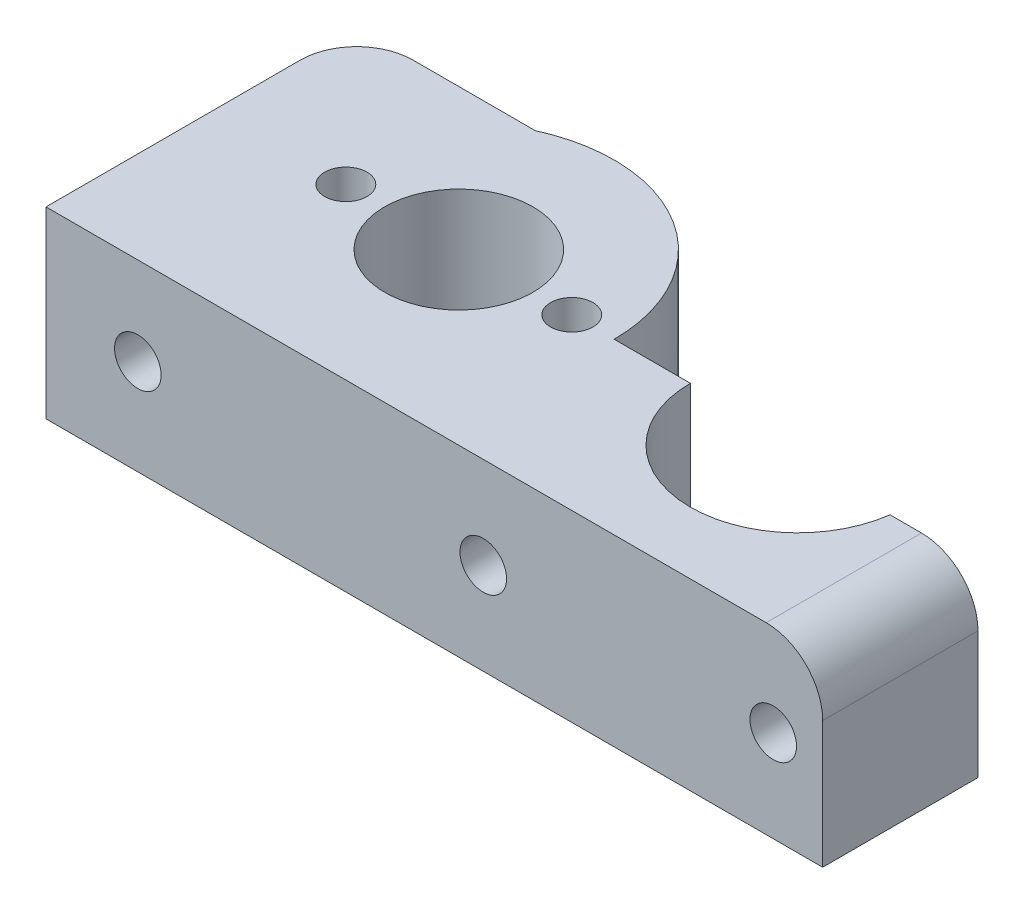
ISO-10303-21;
HEADER;
FILE_DESCRIPTION(('STEP AP214'),'2;1');
FILE_NAME('part.step','',(''),(''),'','','');
FILE_SCHEMA(('AUTOMOTIVE_DESIGN { 1 0 10303 214 1 1 1 1 }'));
ENDSEC;
DATA;
#1=APPLICATION_CONTEXT('core data for automotive mechanical design processes');
#2=APPLICATION_PROTOCOL_DEFINITION('international standard','automotive_design',2000,#1);
#3=PRODUCT_CONTEXT('',#1,'mechanical');
#4=PRODUCT('Part','Part','',(#3));
#5=PRODUCT_RELATED_PRODUCT_CATEGORY('part','',(#4));
#6=PRODUCT_DEFINITION_FORMATION('','',#4);
#7=PRODUCT_DEFINITION_CONTEXT('part definition',#1,'design');
#8=PRODUCT_DEFINITION('design','',#6,#7);
#9=PRODUCT_DEFINITION_SHAPE('','',#8);
#10=(LENGTH_UNIT() NAMED_UNIT(*) SI_UNIT(.MILLI.,.METRE.));
#11=(NAMED_UNIT(*) PLANE_ANGLE_UNIT() SI_UNIT($,.RADIAN.));
#12=(NAMED_UNIT(*) SI_UNIT($,.STERADIAN.) SOLID_ANGLE_UNIT());
#13=UNCERTAINTY_MEASURE_WITH_UNIT(LENGTH_MEASURE(1.E-05),#10,'distance_accuracy_value','');
#14=(GEOMETRIC_REPRESENTATION_CONTEXT(3) GLOBAL_UNCERTAINTY_ASSIGNED_CONTEXT((#13)) GLOBAL_UNIT_ASSIGNED_CONTEXT((#10,
#11,#12)) REPRESENTATION_CONTEXT('',''));
#15=CARTESIAN_POINT('',(0.,0.,0.));
#16=DIRECTION('',(0.,0.,1.));
#17=DIRECTION('',(1.,0.,0.));
#18=AXIS2_PLACEMENT_3D('',#15,#16,#17);
#19=CARTESIAN_POINT('',(12.,13.,0.));
#20=DIRECTION('',(0.,-1.,0.));
#21=DIRECTION('',(0.,0.,-1.));
#22=AXIS2_PLACEMENT_3D('',#19,#20,#21);
#23=CYLINDRICAL_SURFACE('',#22,7.6);
#24=CARTESIAN_POINT('',(12.,0.,0.));
#25=DIRECTION('',(0.,1.,0.));
#26=DIRECTION('',(0.,0.,1.));
#27=AXIS2_PLACEMENT_3D('',#24,#25,#26);
#28=CIRCLE('',#27,7.6);
#29=CARTESIAN_POINT('',(4.4,0.,0.));
#30=VERTEX_POINT('',#29);
#31=CARTESIAN_POINT('',(19.5339232807349,0.,0.999999999999997));
#32=VERTEX_POINT('',#31);
#33=EDGE_CURVE('E129',#30,#32,#28,.T.);
#34=ORIENTED_EDGE('',*,*,#33,.F.);
#35=DIRECTION('',(0.,-1.,0.));
#36=VECTOR('',#35,1.);
#37=CARTESIAN_POINT('',(4.4,13.,0.));
#38=LINE('',#37,#36);
#39=CARTESIAN_POINT('',(4.4,13.,0.));
#40=VERTEX_POINT('',#39);
#41=EDGE_CURVE('E123',#40,#30,#38,.T.);
#42=ORIENTED_EDGE('',*,*,#41,.F.);
#43=CARTESIAN_POINT('',(12.,13.,0.));
#44=DIRECTION('',(0.,1.,0.));
#45=DIRECTION('',(0.,0.,1.));
#46=AXIS2_PLACEMENT_3D('',#43,#44,#45);
#47=CIRCLE('',#46,7.6);
#48=CARTESIAN_POINT('',(19.5339232807349,13.,0.999999999999997));
#49=VERTEX_POINT('',#48);
#50=EDGE_CURVE('E126',#40,#49,#47,.T.);
#51=ORIENTED_EDGE('',*,*,#50,.T.);
#52=DIRECTION('',(0.,-1.,0.));
#53=VECTOR('',#52,1.);
#54=CARTESIAN_POINT('',(19.5339232807349,13.,0.999999999999997));
#55=LINE('',#54,#53);
#56=EDGE_CURVE('E176',#49,#32,#55,.T.);
#57=ORIENTED_EDGE('',*,*,#56,.T.);
#58=EDGE_LOOP('',(#34,#42,#51,#57));
#59=FACE_BOUND('',#58,.T.);
#60=ADVANCED_FACE('F41',(#59),#23,.F.);
#61=CARTESIAN_POINT('',(0.,13.,0.));
#62=DIRECTION('',(0.,0.,1.));
#63=DIRECTION('',(1.,0.,0.));
#64=AXIS2_PLACEMENT_3D('',#61,#62,#63);
#65=PLANE('',#64);
#66=CARTESIAN_POINT('',(1.73303835963196,6.50000000000074,0.));
#67=DIRECTION('',(0.,0.,1.));
#68=DIRECTION('',(1.,0.,0.));
#69=AXIS2_PLACEMENT_3D('',#66,#67,#68);
#70=CIRCLE('',#69,1.65000000000012);
#71=CARTESIAN_POINT('',(3.38303835963208,6.50000000000074,0.));
#72=VERTEX_POINT('',#71);
#73=EDGE_CURVE('E154',#72,#72,#70,.T.);
#74=ORIENTED_EDGE('',*,*,#73,.T.);
#75=EDGE_LOOP('',(#74));
#76=FACE_BOUND('',#75,.T.);
#77=DIRECTION('',(-1.,0.,0.));
#78=VECTOR('',#77,1.);
#79=CARTESIAN_POINT('',(0.,0.,0.));
#80=LINE('',#79,#78);
#81=CARTESIAN_POINT('',(-1.00000000000001,0.,0.));
#82=VERTEX_POINT('',#81);
#83=EDGE_CURVE('E178',#30,#82,#80,.T.);
#84=ORIENTED_EDGE('',*,*,#83,.T.);
#85=DIRECTION('',(0.,-1.,0.));
#86=VECTOR('',#85,1.);
#87=CARTESIAN_POINT('',(-1.00000000000001,13.,0.));
#88=LINE('',#87,#86);
#89=CARTESIAN_POINT('',(-1.00000000000001,13.,0.));
#90=VERTEX_POINT('',#89);
#91=EDGE_CURVE('E133',#90,#82,#88,.T.);
#92=ORIENTED_EDGE('',*,*,#91,.F.);
#93=DIRECTION('',(-1.,0.,0.));
#94=VECTOR('',#93,1.);
#95=CARTESIAN_POINT('',(0.,13.,0.));
#96=LINE('',#95,#94);
#97=EDGE_CURVE('E136',#40,#90,#96,.T.);
#98=ORIENTED_EDGE('',*,*,#97,.F.);
#99=ORIENTED_EDGE('',*,*,#41,.T.);
#100=EDGE_LOOP('',(#84,#92,#98,#99));
#101=FACE_BOUND('',#100,.T.);
#102=ADVANCED_FACE('F137',(#76,#101),#65,.F.);
#103=CARTESIAN_POINT('',(-12.,13.,0.));
#104=DIRECTION('',(0.,-1.,0.));
#105=DIRECTION('',(0.,0.,-1.));
#106=AXIS2_PLACEMENT_3D('',#103,#104,#105);
#107=CYLINDRICAL_SURFACE('',#106,11.);
#108=CARTESIAN_POINT('',(-12.,0.,0.));
#109=DIRECTION('',(0.,1.,0.));
#110=DIRECTION('',(0.,0.,1.));
#111=AXIS2_PLACEMENT_3D('',#108,#109,#110);
#112=CIRCLE('',#111,11.);
#113=CARTESIAN_POINT('',(-16.5825756949558,0.,-10.));
#114=VERTEX_POINT('',#113);
#115=EDGE_CURVE('E180',#82,#114,#112,.T.);
#116=ORIENTED_EDGE('',*,*,#115,.T.);
#117=DIRECTION('',(0.,-1.,0.));
#118=VECTOR('',#117,1.);
#119=CARTESIAN_POINT('',(-16.5825756949558,13.,-10.));
#120=LINE('',#119,#118);
#121=CARTESIAN_POINT('',(-16.5825756949558,13.,-10.));
#122=VERTEX_POINT('',#121);
#123=EDGE_CURVE('E208',#122,#114,#120,.T.);
#124=ORIENTED_EDGE('',*,*,#123,.F.);
#125=CARTESIAN_POINT('',(-12.,13.,0.));
#126=DIRECTION('',(0.,1.,0.));
#127=DIRECTION('',(0.,0.,1.));
#128=AXIS2_PLACEMENT_3D('',#125,#126,#127);
#129=CIRCLE('',#128,11.);
#130=EDGE_CURVE('E142',#90,#122,#129,.T.);
#131=ORIENTED_EDGE('',*,*,#130,.F.);
#132=ORIENTED_EDGE('',*,*,#91,.T.);
#133=EDGE_LOOP('',(#116,#124,#131,#132));
#134=FACE_BOUND('',#133,.T.);
#135=ADVANCED_FACE('F263',(#134),#107,.T.);
#136=CARTESIAN_POINT('',(0.,13.,-10.));
#137=DIRECTION('',(0.,0.,-1.));
#138=DIRECTION('',(-1.,0.,0.));
#139=AXIS2_PLACEMENT_3D('',#136,#137,#138);
#140=PLANE('',#139);
#141=CARTESIAN_POINT('',(-22.7299999999977,6.76191046479369,-10.));
#142=DIRECTION('',(0.,0.,-1.));
#143=DIRECTION('',(-1.,0.,0.));
#144=AXIS2_PLACEMENT_3D('',#141,#142,#143);
#145=CIRCLE('',#144,1.64999999999998);
#146=CARTESIAN_POINT('',(-24.3799999999977,6.76191046479369,-10.));
#147=VERTEX_POINT('',#146);
#148=EDGE_CURVE('E230',#147,#147,#145,.T.);
#149=ORIENTED_EDGE('',*,*,#148,.F.);
#150=EDGE_LOOP('',(#149));
#151=FACE_BOUND('',#150,.T.);
#152=DIRECTION('',(1.,0.,0.));
#153=VECTOR('',#152,1.);
#154=CARTESIAN_POINT('',(0.,0.,-10.));
#155=LINE('',#154,#153);
#156=CARTESIAN_POINT('',(-25.2330383596325,0.,-10.));
#157=VERTEX_POINT('',#156);
#158=EDGE_CURVE('E183',#157,#114,#155,.T.);
#159=ORIENTED_EDGE('',*,*,#158,.F.);
#160=DIRECTION('',(0.,-1.,0.));
#161=VECTOR('',#160,1.);
#162=CARTESIAN_POINT('',(-25.2330383596325,13.,-10.));
#163=LINE('',#162,#161);
#164=CARTESIAN_POINT('',(-25.2330383596325,13.,-10.));
#165=VERTEX_POINT('',#164);
#166=EDGE_CURVE('E55',#157,#165,#163,.F.);
#167=ORIENTED_EDGE('',*,*,#166,.T.);
#168=DIRECTION('',(1.,0.,0.));
#169=VECTOR('',#168,1.);
#170=CARTESIAN_POINT('',(0.,13.,-10.));
#171=LINE('',#170,#169);
#172=EDGE_CURVE('E158',#165,#122,#171,.T.);
#173=ORIENTED_EDGE('',*,*,#172,.T.);
#174=ORIENTED_EDGE('',*,*,#123,.T.);
#175=EDGE_LOOP('',(#159,#167,#173,#174));
#176=FACE_BOUND('',#175,.T.);
#177=ADVANCED_FACE('F310',(#151,#176),#140,.T.);
#178=CARTESIAN_POINT('',(-29.2330383596325,13.,0.));
#179=DIRECTION('',(-1.,0.,0.));
#180=DIRECTION('',(0.,0.,1.));
#181=AXIS2_PLACEMENT_3D('',#178,#179,#180);
#182=PLANE('',#181);
#183=DIRECTION('',(0.,0.,-1.));
#184=VECTOR('',#183,1.);
#185=CARTESIAN_POINT('',(-29.2330383596325,13.,0.));
#186=LINE('',#185,#184);
#187=CARTESIAN_POINT('',(-29.2330383596325,13.,12.));
#188=VERTEX_POINT('',#187);
#189=CARTESIAN_POINT('',(-29.2330383596325,13.,-6.));
#190=VERTEX_POINT('',#189);
#191=EDGE_CURVE('E160',#188,#190,#186,.T.);
#192=ORIENTED_EDGE('',*,*,#191,.T.);
#193=DIRECTION('',(0.,-1.,0.));
#194=VECTOR('',#193,1.);
#195=CARTESIAN_POINT('',(-29.2330383596325,13.,-6.));
#196=LINE('',#195,#194);
#197=CARTESIAN_POINT('',(-29.2330383596325,0.,-6.));
#198=VERTEX_POINT('',#197);
#199=EDGE_CURVE('E220',#190,#198,#196,.T.);
#200=ORIENTED_EDGE('',*,*,#199,.T.);
#201=DIRECTION('',(0.,0.,-1.));
#202=VECTOR('',#201,1.);
#203=CARTESIAN_POINT('',(-29.2330383596325,0.,0.));
#204=LINE('',#203,#202);
#205=CARTESIAN_POINT('',(-29.2330383596325,0.,12.));
#206=VERTEX_POINT('',#205);
#207=EDGE_CURVE('E185',#206,#198,#204,.T.);
#208=ORIENTED_EDGE('',*,*,#207,.F.);
#209=DIRECTION('',(0.,-1.,0.));
#210=VECTOR('',#209,1.);
#211=CARTESIAN_POINT('',(-29.2330383596325,13.,12.));
#212=LINE('',#211,#210);
#213=EDGE_CURVE('E206',#188,#206,#212,.T.);
#214=ORIENTED_EDGE('',*,*,#213,.F.);
#215=EDGE_LOOP('',(#192,#200,#208,#214));
#216=FACE_BOUND('',#215,.T.);
#217=ADVANCED_FACE('F297',(#216),#182,.T.);
#218=CARTESIAN_POINT('',(0.,13.,12.));
#219=DIRECTION('',(0.,0.,-1.));
#220=DIRECTION('',(-1.,0.,0.));
#221=AXIS2_PLACEMENT_3D('',#218,#219,#220);
#222=PLANE('',#221);
#223=CARTESIAN_POINT('',(22.2669616403669,6.50000000000074,12.));
#224=DIRECTION('',(0.,0.,1.));
#225=DIRECTION('',(1.,0.,0.));
#226=AXIS2_PLACEMENT_3D('',#223,#224,#225);
#227=CIRCLE('',#226,1.65000000000012);
#228=CARTESIAN_POINT('',(23.916961640367,6.50000000000074,12.));
#229=VERTEX_POINT('',#228);
#230=EDGE_CURVE('E226',#229,#229,#227,.T.);
#231=ORIENTED_EDGE('',*,*,#230,.F.);
#232=EDGE_LOOP('',(#231));
#233=FACE_BOUND('',#232,.T.);
#234=CARTESIAN_POINT('',(1.73303835963196,6.50000000000074,12.));
#235=DIRECTION('',(0.,0.,1.));
#236=DIRECTION('',(1.,0.,0.));
#237=AXIS2_PLACEMENT_3D('',#234,#235,#236);
#238=CIRCLE('',#237,1.65000000000012);
#239=CARTESIAN_POINT('',(3.38303835963208,6.50000000000074,12.));
#240=VERTEX_POINT('',#239);
#241=EDGE_CURVE('E232',#240,#240,#238,.T.);
#242=ORIENTED_EDGE('',*,*,#241,.F.);
#243=EDGE_LOOP('',(#242));
#244=FACE_BOUND('',#243,.T.);
#245=CARTESIAN_POINT('',(-22.7299999999977,6.76191046479369,12.));
#246=DIRECTION('',(0.,0.,1.));
#247=DIRECTION('',(1.,0.,0.));
#248=AXIS2_PLACEMENT_3D('',#245,#246,#247);
#249=CIRCLE('',#248,1.64999999999998);
#250=CARTESIAN_POINT('',(-21.0799999999977,6.76191046479369,12.));
#251=VERTEX_POINT('',#250);
#252=EDGE_CURVE('E237',#251,#251,#249,.T.);
#253=ORIENTED_EDGE('',*,*,#252,.F.);
#254=EDGE_LOOP('',(#253));
#255=FACE_BOUND('',#254,.T.);
#256=DIRECTION('',(0.,-1.,0.));
#257=VECTOR('',#256,1.);
#258=CARTESIAN_POINT('',(25.7669616403675,13.,12.));
#259=LINE('',#258,#257);
#260=CARTESIAN_POINT('',(25.7669616403675,9.,12.));
#261=VERTEX_POINT('',#260);
#262=CARTESIAN_POINT('',(25.7669616403675,0.,12.));
#263=VERTEX_POINT('',#262);
#264=EDGE_CURVE('E204',#261,#263,#259,.T.);
#265=ORIENTED_EDGE('',*,*,#264,.F.);
#266=CARTESIAN_POINT('',(21.7669616403675,9.,12.));
#267=DIRECTION('',(0.,0.,-1.));
#268=DIRECTION('',(-1.,0.,0.));
#269=AXIS2_PLACEMENT_3D('',#266,#267,#268);
#270=CIRCLE('',#269,4.);
#271=CARTESIAN_POINT('',(21.7669616403675,13.,12.));
#272=VERTEX_POINT('',#271);
#273=EDGE_CURVE('E214',#261,#272,#270,.F.);
#274=ORIENTED_EDGE('',*,*,#273,.T.);
#275=DIRECTION('',(1.,0.,0.));
#276=VECTOR('',#275,1.);
#277=CARTESIAN_POINT('',(0.,13.,12.));
#278=LINE('',#277,#276);
#279=EDGE_CURVE('E163',#188,#272,#278,.T.);
#280=ORIENTED_EDGE('',*,*,#279,.F.);
#281=ORIENTED_EDGE('',*,*,#213,.T.);
#282=DIRECTION('',(1.,0.,0.));
#283=VECTOR('',#282,1.);
#284=CARTESIAN_POINT('',(0.,0.,12.));
#285=LINE('',#284,#283);
#286=EDGE_CURVE('E187',#206,#263,#285,.T.);
#287=ORIENTED_EDGE('',*,*,#286,.T.);
#288=EDGE_LOOP('',(#265,#274,#280,#281,#287));
#289=FACE_BOUND('',#288,.T.);
#290=ADVANCED_FACE('F299',(#233,#244,#255,#289),#222,.F.);
#291=CARTESIAN_POINT('',(25.7669616403675,13.,0.));
#292=DIRECTION('',(1.,0.,0.));
#293=DIRECTION('',(0.,0.,-1.));
#294=AXIS2_PLACEMENT_3D('',#291,#292,#293);
#295=PLANE('',#294);
#296=DIRECTION('',(0.,-1.,0.));
#297=VECTOR('',#296,1.);
#298=CARTESIAN_POINT('',(25.7669616403675,13.,0.999999999999998));
#299=LINE('',#298,#297);
#300=CARTESIAN_POINT('',(25.7669616403675,9.,0.999999999999998));
#301=VERTEX_POINT('',#300);
#302=CARTESIAN_POINT('',(25.7669616403675,0.,0.999999999999998));
#303=VERTEX_POINT('',#302);
#304=EDGE_CURVE('E202',#301,#303,#299,.T.);
#305=ORIENTED_EDGE('',*,*,#304,.F.);
#306=DIRECTION('',(0.,0.,1.));
#307=VECTOR('',#306,1.);
#308=CARTESIAN_POINT('',(25.7669616403675,9.,0.));
#309=LINE('',#308,#307);
#310=EDGE_CURVE('E132',#301,#261,#309,.T.);
#311=ORIENTED_EDGE('',*,*,#310,.T.);
#312=ORIENTED_EDGE('',*,*,#264,.T.);
#313=DIRECTION('',(0.,0.,1.));
#314=VECTOR('',#313,1.);
#315=CARTESIAN_POINT('',(25.7669616403675,0.,0.));
#316=LINE('',#315,#314);
#317=EDGE_CURVE('E190',#303,#263,#316,.T.);
#318=ORIENTED_EDGE('',*,*,#317,.F.);
#319=EDGE_LOOP('',(#305,#311,#312,#318));
#320=FACE_BOUND('',#319,.T.);
#321=ADVANCED_FACE('F285',(#320),#295,.T.);
#322=CARTESIAN_POINT('',(-20.,13.,0.));
#323=DIRECTION('',(0.,-1.,0.));
#324=DIRECTION('',(0.,0.,-1.));
#325=AXIS2_PLACEMENT_3D('',#322,#323,#324);
#326=CYLINDRICAL_SURFACE('',#325,1.5);
#327=CARTESIAN_POINT('',(-21.0799999999977,6.76191046479369,-1.04096109437619));
#328=CARTESIAN_POINT('',(-21.0800029915842,6.8230927902981,-1.04096232564757));
#329=CARTESIAN_POINT('',(-21.083424639962,6.88431383293778,-1.03744392787708));
#330=CARTESIAN_POINT('',(-21.0969029782797,7.00522431001875,-1.02318012152308));
#331=CARTESIAN_POINT('',(-21.1069671087234,7.06491194885125,-1.0124266083417));
#332=CARTESIAN_POINT('',(-21.1330413049773,7.18116529338869,-0.983159096682626));
#333=CARTESIAN_POINT('',(-21.1490638359342,7.23772416663396,-0.964628818465511));
#334=CARTESIAN_POINT('',(-21.1856987871427,7.345762437771,-0.919219241108234));
#335=CARTESIAN_POINT('',(-21.2063078708161,7.39724548908079,-0.892346005631743));
#336=CARTESIAN_POINT('',(-21.2494032421715,7.49195110617756,-0.830873283110584));
#337=CARTESIAN_POINT('',(-21.2718120047312,7.53537950915377,-0.796537724554583));
#338=CARTESIAN_POINT('',(-21.3166632951955,7.61458590761367,-0.719969983421487));
#339=CARTESIAN_POINT('',(-21.3391058078848,7.65036667534722,-0.677740672752459));
#340=CARTESIAN_POINT('',(-21.379988856578,7.71123679088069,-0.589752116888709));
#341=CARTESIAN_POINT('',(-21.3986023815227,7.73691931027006,-0.544481619976488));
#342=CARTESIAN_POINT('',(-21.4320370643088,7.78100870689032,-0.449238827365047));
#343=CARTESIAN_POINT('',(-21.4468579532524,7.79941506829228,-0.399266198628228));
#344=CARTESIAN_POINT('',(-21.4713074052007,7.82894301971109,-0.296658552891623));
#345=CARTESIAN_POINT('',(-21.4809922766154,7.8401439093507,-0.244059633705193));
#346=CARTESIAN_POINT('',(-21.4946896114799,7.85581042306009,-0.137145430879147));
#347=CARTESIAN_POINT('',(-21.4987011851954,7.8602749906904,-0.0828298793880172));
#348=CARTESIAN_POINT('',(-21.5007866861364,7.86260940188173,0.0273841515109055));
#349=CARTESIAN_POINT('',(-21.4987136543445,7.86031601813189,0.0832889705133993));
#350=CARTESIAN_POINT('',(-21.4884625889077,7.84871489408654,0.193799628698839));
#351=CARTESIAN_POINT('',(-21.4802844861364,7.83940707436808,0.248405453166326));
#352=CARTESIAN_POINT('',(-21.4584157820033,7.81350935645346,0.354952457810932));
#353=CARTESIAN_POINT('',(-21.4447039443153,7.79689138235649,0.406882493574653));
#354=CARTESIAN_POINT('',(-21.4129433577434,7.75615610887191,0.506272420694436));
#355=CARTESIAN_POINT('',(-21.3948960825064,7.73204135687669,0.553733823357868));
#356=CARTESIAN_POINT('',(-21.3565983459944,7.67698471769275,0.641790966194899));
#357=CARTESIAN_POINT('',(-21.3364087817926,7.6462143808967,0.682520550502571));
#358=CARTESIAN_POINT('',(-21.2953809208694,7.57796724996601,0.75750825498601));
#359=CARTESIAN_POINT('',(-21.2745426511472,7.54049073463575,0.791766644075231));
#360=CARTESIAN_POINT('',(-21.2341824469671,7.4598045381142,0.853316443465316));
#361=CARTESIAN_POINT('',(-21.2146568331889,7.41661198357314,0.880627980572508));
#362=CARTESIAN_POINT('',(-21.1784763080492,7.32553881599503,0.928491634447127));
#363=CARTESIAN_POINT('',(-21.1618223651267,7.27765662993476,0.949041473020844));
#364=CARTESIAN_POINT('',(-21.1317459746372,7.17552948907524,0.984749218290148));
#365=CARTESIAN_POINT('',(-21.1185717623102,7.12107586332047,0.99951806174488));
#366=CARTESIAN_POINT('',(-21.0977370154719,7.0097601066277,1.02235616823007));
#367=CARTESIAN_POINT('',(-21.0900788084414,6.95289696969803,1.03042260339676));
#368=CARTESIAN_POINT('',(-21.080388009146,6.83358682249392,1.04058550026029));
#369=CARTESIAN_POINT('',(-21.0788491190747,6.77105430968391,1.04215841892836));
#370=CARTESIAN_POINT('',(-21.0828640758345,6.64644562954053,1.03798486081114));
#371=CARTESIAN_POINT('',(-21.0884202755788,6.58436962046293,1.03223595592362));
#372=CARTESIAN_POINT('',(-21.106509347996,6.4605792394601,1.01282740808279));
#373=CARTESIAN_POINT('',(-21.1192422685107,6.39892899665611,0.998940458940803));
#374=CARTESIAN_POINT('',(-21.1507738314602,6.2799051147996,0.962443469460773));
#375=CARTESIAN_POINT('',(-21.1695697151321,6.2225295452782,0.939837395575699));
#376=CARTESIAN_POINT('',(-21.2103955037607,6.11664248748591,0.886571322998355));
#377=CARTESIAN_POINT('',(-21.2322307215868,6.06784032320965,0.856342172177723));
#378=CARTESIAN_POINT('',(-21.2774483021482,5.97760104256024,0.787285283340712));
#379=CARTESIAN_POINT('',(-21.3008295704144,5.93615879101187,0.748463583357281));
#380=CARTESIAN_POINT('',(-21.3445747777866,5.86485549475354,0.666404754825477));
#381=CARTESIAN_POINT('',(-21.3650282125098,5.83431942157317,0.623799898830069));
#382=CARTESIAN_POINT('',(-21.4029994052022,5.78076247581505,0.532929588807184));
#383=CARTESIAN_POINT('',(-21.4205171572812,5.75774161831597,0.484664123422407));
#384=CARTESIAN_POINT('',(-21.4505120993096,5.71980687384857,0.385504637091636));
#385=CARTESIAN_POINT('',(-21.4631315641616,5.70465897288249,0.334742576770721));
#386=CARTESIAN_POINT('',(-21.4831048965537,5.68117391407769,0.230669412710194));
#387=CARTESIAN_POINT('',(-21.4904580073851,5.67283773497318,0.177357943826278));
#388=CARTESIAN_POINT('',(-21.4994507634838,5.66268490750023,0.0685014332335293));
#389=CARTESIAN_POINT('',(-21.5009666888094,5.66100940954443,0.0129329976646825));
#390=CARTESIAN_POINT('',(-21.4978321921623,5.66451921653769,-0.097816868757893));
#391=CARTESIAN_POINT('',(-21.4931811745091,5.66970518425299,-0.152998261708597));
#392=CARTESIAN_POINT('',(-21.4779562652543,5.68719092776247,-0.262143620950849));
#393=CARTESIAN_POINT('',(-21.4673059384677,5.69958257589049,-0.316082332632408));
#394=CARTESIAN_POINT('',(-21.4408967472195,5.73179230246206,-0.420366674161648));
#395=CARTESIAN_POINT('',(-21.4251392364332,5.7516084132451,-0.470713251806118));
#396=CARTESIAN_POINT('',(-21.3902442587098,5.79838273586754,-0.565441448589154));
#397=CARTESIAN_POINT('',(-21.3711732752764,5.8252048972843,-0.609914690323865));
#398=CARTESIAN_POINT('',(-21.3312391395215,5.88596308353176,-0.692762222422918));
#399=CARTESIAN_POINT('',(-21.3103764201191,5.91989739276386,-0.731137979710089));
#400=CARTESIAN_POINT('',(-21.2691547487739,5.99367515283061,-0.800534042924279));
#401=CARTESIAN_POINT('',(-21.2487930035347,6.03341872180637,-0.831659260288106));
#402=CARTESIAN_POINT('',(-21.2100142347832,6.11823530585837,-0.887138857257334));
#403=CARTESIAN_POINT('',(-21.1915981925808,6.16331098610818,-0.911489830306454));
#404=CARTESIAN_POINT('',(-21.1574679970273,6.25955799344508,-0.954492364801959));
#405=CARTESIAN_POINT('',(-21.1418987790568,6.31090526122166,-0.972863473624721));
#406=CARTESIAN_POINT('',(-21.1156048167947,6.4166639600287,-1.00290916500418));
#407=CARTESIAN_POINT('',(-21.1048772652222,6.47107359480844,-1.01458762913304));
#408=CARTESIAN_POINT('',(-21.0913195359171,6.56503404064703,-1.02911856444622));
#409=CARTESIAN_POINT('',(-21.087086075227,6.60415108792458,-1.0335672121562));
#410=CARTESIAN_POINT('',(-21.0814252803149,6.68281017121145,-1.03948814253097));
#411=CARTESIAN_POINT('',(-21.0799980657481,6.72235222527033,-1.04096029828144));
#412=CARTESIAN_POINT('',(-21.0799999999977,6.76191046479369,-1.04096109437619));
#413=B_SPLINE_CURVE_WITH_KNOTS('',3,(#327,#328,#329,#330,#331,#332,#333,#334,#335,#336,#337,
#338,#339,#340,#341,#342,#343,#344,#345,#346,#347,#348,#349,#350,#351,#352,#353,#354,#355,#356,
#357,#358,#359,#360,#361,#362,#363,#364,#365,#366,#367,#368,#369,#370,#371,#372,#373,#374,#375,
#376,#377,#378,#379,#380,#381,#382,#383,#384,#385,#386,#387,#388,#389,#390,#391,#392,#393,#394,
#395,#396,#397,#398,#399,#400,#401,#402,#403,#404,#405,#406,#407,#408,#409,#410,#411,#412),
.UNSPECIFIED.,.T.,.F.,(4,2,2,2,2,2,2,2,2,2,2,2,2,2,2,2,2,2,2,2,2,2,2,2,2,2,2,2,2,2,2,2,2,2,2,2,
2,2,2,2,2,2,4),(0.,0.183415969749937,0.367037740373323,0.551045834118067,0.734920502584926,
0.913122681322979,1.09126015221725,1.25628322152384,1.42131798771965,1.58450390641205,
1.74771541445916,1.91490109007518,2.08208865872718,2.24992402377438,2.41770242087033,
2.58158453065269,2.74545982874071,2.90885478660163,3.07230474027487,3.24538580293312,
3.41853985450349,3.60541065231887,3.79234343736596,3.98476463143842,4.17709839344019,
4.36034758542636,4.543468413704,4.71141806299174,4.87936804925506,5.04199006758184,
5.20463544795446,5.37070973350002,5.53680006175008,5.70505597242027,5.87326732274874,
6.03842791773674,6.20354871829912,6.36610688647477,6.5287466529252,6.69817782680349,
6.86751063498698,6.98609559318222,7.10468560760158),.UNSPECIFIED.);
#414=CARTESIAN_POINT('',(-21.0799999999977,6.76191046479369,-1.04096109437619));
#415=VERTEX_POINT('',#414);
#416=EDGE_CURVE('E45',#415,#415,#413,.T.);
#417=ORIENTED_EDGE('',*,*,#416,.F.);
#418=EDGE_LOOP('',(#417));
#419=FACE_BOUND('',#418,.T.);
#420=CARTESIAN_POINT('',(-20.,13.,0.));
#421=DIRECTION('',(0.,1.,0.));
#422=DIRECTION('',(0.,0.,1.));
#423=AXIS2_PLACEMENT_3D('',#420,#421,#422);
#424=CIRCLE('',#423,1.5);
#425=CARTESIAN_POINT('',(-20.,13.,1.5));
#426=VERTEX_POINT('',#425);
#427=EDGE_CURVE('E170',#426,#426,#424,.T.);
#428=ORIENTED_EDGE('',*,*,#427,.T.);
#429=EDGE_LOOP('',(#428));
#430=FACE_BOUND('',#429,.T.);
#431=CARTESIAN_POINT('',(-20.,0.,0.));
#432=DIRECTION('',(0.,1.,0.));
#433=DIRECTION('',(0.,0.,1.));
#434=AXIS2_PLACEMENT_3D('',#431,#432,#433);
#435=CIRCLE('',#434,1.5);
#436=CARTESIAN_POINT('',(-20.,0.,1.5));
#437=VERTEX_POINT('',#436);
#438=EDGE_CURVE('E151',#437,#437,#435,.T.);
#439=ORIENTED_EDGE('',*,*,#438,.F.);
#440=EDGE_LOOP('',(#439));
#441=FACE_BOUND('',#440,.T.);
#442=ADVANCED_FACE('F308',(#419,#430,#441),#326,.F.);
#443=CARTESIAN_POINT('',(-4.,13.,0.));
#444=DIRECTION('',(0.,-1.,0.));
#445=DIRECTION('',(0.,0.,-1.));
#446=AXIS2_PLACEMENT_3D('',#443,#444,#445);
#447=CYLINDRICAL_SURFACE('',#446,1.5);
#448=CARTESIAN_POINT('',(-4.,13.,0.));
#449=DIRECTION('',(0.,1.,0.));
#450=DIRECTION('',(0.,0.,1.));
#451=AXIS2_PLACEMENT_3D('',#448,#449,#450);
#452=CIRCLE('',#451,1.5);
#453=CARTESIAN_POINT('',(-4.,13.,-1.5));
#454=VERTEX_POINT('',#453);
#455=EDGE_CURVE('E167',#454,#454,#452,.T.);
#456=CARTESIAN_POINT('',(-4.,0.,0.));
#457=DIRECTION('',(0.,1.,0.));
#458=DIRECTION('',(0.,0.,1.));
#459=AXIS2_PLACEMENT_3D('',#456,#457,#458);
#460=CIRCLE('',#459,1.5);
#461=CARTESIAN_POINT('',(-4.,0.,-1.5));
#462=VERTEX_POINT('',#461);
#463=EDGE_CURVE('E196',#462,#462,#460,.T.);
#464=CARTESIAN_POINT('',(-4.,13.,-1.5));
#465=CARTESIAN_POINT('',(-4.,12.8645833333333,-1.5));
#466=CARTESIAN_POINT('',(-4.,12.7291666666667,-1.5));
#467=CARTESIAN_POINT('',(-4.,12.4583333333333,-1.5));
#468=CARTESIAN_POINT('',(-4.,12.3229166666667,-1.5));
#469=CARTESIAN_POINT('',(-4.,12.0520833333333,-1.5));
#470=CARTESIAN_POINT('',(-4.,11.9166666666667,-1.5));
#471=CARTESIAN_POINT('',(-4.,11.6458333333333,-1.5));
#472=CARTESIAN_POINT('',(-4.,11.5104166666667,-1.5));
#473=CARTESIAN_POINT('',(-4.,11.2395833333333,-1.5));
#474=CARTESIAN_POINT('',(-4.,11.1041666666667,-1.5));
#475=CARTESIAN_POINT('',(-4.,10.8333333333333,-1.5));
#476=CARTESIAN_POINT('',(-4.,10.6979166666667,-1.5));
#477=CARTESIAN_POINT('',(-4.,10.4270833333333,-1.5));
#478=CARTESIAN_POINT('',(-4.,10.2916666666667,-1.5));
#479=CARTESIAN_POINT('',(-4.,10.0208333333333,-1.5));
#480=CARTESIAN_POINT('',(-4.,9.88541666666667,-1.5));
#481=CARTESIAN_POINT('',(-4.,9.61458333333333,-1.5));
#482=CARTESIAN_POINT('',(-4.,9.47916666666667,-1.5));
#483=CARTESIAN_POINT('',(-4.,9.20833333333333,-1.5));
#484=CARTESIAN_POINT('',(-4.,9.07291666666666,-1.5));
#485=CARTESIAN_POINT('',(-4.,8.80208333333333,-1.5));
#486=CARTESIAN_POINT('',(-4.,8.66666666666667,-1.5));
#487=CARTESIAN_POINT('',(-4.,8.39583333333333,-1.5));
#488=CARTESIAN_POINT('',(-4.,8.26041666666667,-1.5));
#489=CARTESIAN_POINT('',(-4.,7.98958333333333,-1.5));
#490=CARTESIAN_POINT('',(-4.,7.85416666666667,-1.5));
#491=CARTESIAN_POINT('',(-4.,7.58333333333333,-1.5));
#492=CARTESIAN_POINT('',(-4.,7.44791666666667,-1.5));
#493=CARTESIAN_POINT('',(-4.,7.17708333333333,-1.5));
#494=CARTESIAN_POINT('',(-4.,7.04166666666667,-1.5));
#495=CARTESIAN_POINT('',(-4.,6.77083333333333,-1.5));
#496=CARTESIAN_POINT('',(-4.,6.63541666666667,-1.5));
#497=CARTESIAN_POINT('',(-4.,6.36458333333333,-1.5));
#498=CARTESIAN_POINT('',(-4.,6.22916666666667,-1.5));
#499=CARTESIAN_POINT('',(-4.,5.95833333333333,-1.5));
#500=CARTESIAN_POINT('',(-4.,5.82291666666667,-1.5));
#501=CARTESIAN_POINT('',(-4.,5.55208333333333,-1.5));
#502=CARTESIAN_POINT('',(-4.,5.41666666666667,-1.5));
#503=CARTESIAN_POINT('',(-4.,5.14583333333333,-1.5));
#504=CARTESIAN_POINT('',(-4.,5.01041666666667,-1.5));
#505=CARTESIAN_POINT('',(-4.,4.73958333333333,-1.5));
#506=CARTESIAN_POINT('',(-4.,4.60416666666667,-1.5));
#507=CARTESIAN_POINT('',(-4.,4.33333333333333,-1.5));
#508=CARTESIAN_POINT('',(-4.,4.19791666666667,-1.5));
#509=CARTESIAN_POINT('',(-4.,3.92708333333333,-1.5));
#510=CARTESIAN_POINT('',(-4.,3.79166666666667,-1.5));
#511=CARTESIAN_POINT('',(-4.,3.52083333333333,-1.5));
#512=CARTESIAN_POINT('',(-4.,3.38541666666667,-1.5));
#513=CARTESIAN_POINT('',(-4.,3.11458333333333,-1.5));
#514=CARTESIAN_POINT('',(-4.,2.97916666666667,-1.5));
#515=CARTESIAN_POINT('',(-4.,2.70833333333333,-1.5));
#516=CARTESIAN_POINT('',(-4.,2.57291666666667,-1.5));
#517=CARTESIAN_POINT('',(-4.,2.30208333333333,-1.5));
#518=CARTESIAN_POINT('',(-4.,2.16666666666667,-1.5));
#519=CARTESIAN_POINT('',(-4.,1.89583333333333,-1.5));
#520=CARTESIAN_POINT('',(-4.,1.76041666666667,-1.5));
#521=CARTESIAN_POINT('',(-4.,1.48958333333333,-1.5));
#522=CARTESIAN_POINT('',(-4.,1.35416666666667,-1.5));
#523=CARTESIAN_POINT('',(-4.,1.08333333333333,-1.5));
#524=CARTESIAN_POINT('',(-4.,0.947916666666667,-1.5));
#525=CARTESIAN_POINT('',(-4.,0.677083333333334,-1.5));
#526=CARTESIAN_POINT('',(-4.,0.541666666666667,-1.5));
#527=CARTESIAN_POINT('',(-4.,0.270833333333334,-1.5));
#528=CARTESIAN_POINT('',(-4.,0.135416666666667,-1.5));
#529=CARTESIAN_POINT('',(-4.,0.,-1.5));
#530=B_SPLINE_CURVE_WITH_KNOTS('',3,(#464,#465,#466,#467,#468,#469,#470,#471,#472,#473,#474,
#475,#476,#477,#478,#479,#480,#481,#482,#483,#484,#485,#486,#487,#488,#489,#490,#491,#492,#493,
#494,#495,#496,#497,#498,#499,#500,#501,#502,#503,#504,#505,#506,#507,#508,#509,#510,#511,#512,
#513,#514,#515,#516,#517,#518,#519,#520,#521,#522,#523,#524,#525,#526,#527,#528,#529),
.UNSPECIFIED.,.F.,.F.,(4,2,2,2,2,2,2,2,2,2,2,2,2,2,2,2,2,2,2,2,2,2,2,2,2,2,2,2,2,2,2,2,4),(0.,
0.40625,0.812500000000001,1.21875,1.625,2.03125,2.4375,2.84375,3.25,3.65625,4.0625,4.46875,
4.875,5.28125,5.6875,6.09375,6.5,6.90625,7.3125,7.71875,8.125,8.53125,8.9375,9.34375,9.75,
10.15625,10.5625,10.96875,11.375,11.78125,12.1875,12.59375,13.),.UNSPECIFIED.);
#531=EDGE_CURVE('BSEAM401',#454,#462,#530,.T.);
#532=ORIENTED_EDGE('',*,*,#455,.T.);
#533=ORIENTED_EDGE('',*,*,#463,.F.);
#534=ORIENTED_EDGE('',*,*,#531,.T.);
#535=ORIENTED_EDGE('',*,*,#531,.F.);
#536=EDGE_LOOP('',(#532,#534,#533,#535));
#537=FACE_BOUND('',#536,.T.);
#538=ADVANCED_FACE('F401',(#537),#447,.F.);
#539=CARTESIAN_POINT('',(0.,13.,0.999999999999994));
#540=DIRECTION('',(0.,0.,-1.));
#541=DIRECTION('',(-1.,0.,0.));
#542=AXIS2_PLACEMENT_3D('',#539,#540,#541);
#543=PLANE('',#542);
#544=CARTESIAN_POINT('',(22.2669616403669,6.50000000000074,0.999999999999997));
#545=DIRECTION('',(0.,0.,-1.));
#546=DIRECTION('',(-1.,0.,0.));
#547=AXIS2_PLACEMENT_3D('',#544,#545,#546);
#548=CIRCLE('',#547,1.65000000000012);
#549=CARTESIAN_POINT('',(20.6169616403668,6.50000000000074,0.999999999999997));
#550=VERTEX_POINT('',#549);
#551=EDGE_CURVE('E224',#550,#550,#548,.T.);
#552=ORIENTED_EDGE('',*,*,#551,.F.);
#553=EDGE_LOOP('',(#552));
#554=FACE_BOUND('',#553,.T.);
#555=DIRECTION('',(1.,0.,0.));
#556=VECTOR('',#555,1.);
#557=CARTESIAN_POINT('',(0.,13.,0.999999999999994));
#558=LINE('',#557,#556);
#559=CARTESIAN_POINT('',(21.7669616403675,13.,0.999999999999997));
#560=VERTEX_POINT('',#559);
#561=EDGE_CURVE('E147',#49,#560,#558,.T.);
#562=ORIENTED_EDGE('',*,*,#561,.T.);
#563=CARTESIAN_POINT('',(21.7669616403675,9.,0.999999999999997));
#564=DIRECTION('',(0.,0.,-1.));
#565=DIRECTION('',(-1.,0.,0.));
#566=AXIS2_PLACEMENT_3D('',#563,#564,#565);
#567=CIRCLE('',#566,4.);
#568=EDGE_CURVE('E218',#560,#301,#567,.T.);
#569=ORIENTED_EDGE('',*,*,#568,.T.);
#570=ORIENTED_EDGE('',*,*,#304,.T.);
#571=DIRECTION('',(1.,0.,0.));
#572=VECTOR('',#571,1.);
#573=CARTESIAN_POINT('',(0.,0.,0.999999999999994));
#574=LINE('',#573,#572);
#575=EDGE_CURVE('E193',#32,#303,#574,.T.);
#576=ORIENTED_EDGE('',*,*,#575,.F.);
#577=ORIENTED_EDGE('',*,*,#56,.F.);
#578=EDGE_LOOP('',(#562,#569,#570,#576,#577));
#579=FACE_BOUND('',#578,.T.);
#580=ADVANCED_FACE('F281',(#554,#579),#543,.T.);
#581=CARTESIAN_POINT('',(-12.,13.,0.));
#582=DIRECTION('',(0.,-1.,0.));
#583=DIRECTION('',(0.,0.,-1.));
#584=AXIS2_PLACEMENT_3D('',#581,#582,#583);
#585=CYLINDRICAL_SURFACE('',#584,5.25);
#586=CARTESIAN_POINT('',(-12.,13.,0.));
#587=DIRECTION('',(0.,1.,0.));
#588=DIRECTION('',(0.,0.,1.));
#589=AXIS2_PLACEMENT_3D('',#586,#587,#588);
#590=CIRCLE('',#589,5.25);
#591=CARTESIAN_POINT('',(-12.,13.,-5.25));
#592=VERTEX_POINT('',#591);
#593=EDGE_CURVE('E173',#592,#592,#590,.T.);
#594=CARTESIAN_POINT('',(-12.,0.,0.));
#595=DIRECTION('',(0.,1.,0.));
#596=DIRECTION('',(0.,0.,1.));
#597=AXIS2_PLACEMENT_3D('',#594,#595,#596);
#598=CIRCLE('',#597,5.25);
#599=CARTESIAN_POINT('',(-12.,0.,-5.25));
#600=VERTEX_POINT('',#599);
#601=EDGE_CURVE('E148',#600,#600,#598,.T.);
#602=CARTESIAN_POINT('',(-12.,13.,-5.25));
#603=CARTESIAN_POINT('',(-12.,12.8645833333333,-5.25));
#604=CARTESIAN_POINT('',(-12.,12.7291666666667,-5.25));
#605=CARTESIAN_POINT('',(-12.,12.4583333333333,-5.25));
#606=CARTESIAN_POINT('',(-12.,12.3229166666667,-5.25));
#607=CARTESIAN_POINT('',(-12.,12.0520833333333,-5.25));
#608=CARTESIAN_POINT('',(-12.,11.9166666666667,-5.25));
#609=CARTESIAN_POINT('',(-12.,11.6458333333333,-5.25));
#610=CARTESIAN_POINT('',(-12.,11.5104166666667,-5.25));
#611=CARTESIAN_POINT('',(-12.,11.2395833333333,-5.25));
#612=CARTESIAN_POINT('',(-12.,11.1041666666667,-5.25));
#613=CARTESIAN_POINT('',(-12.,10.8333333333333,-5.25));
#614=CARTESIAN_POINT('',(-12.,10.6979166666667,-5.25));
#615=CARTESIAN_POINT('',(-12.,10.4270833333333,-5.25));
#616=CARTESIAN_POINT('',(-12.,10.2916666666667,-5.25));
#617=CARTESIAN_POINT('',(-12.,10.0208333333333,-5.25));
#618=CARTESIAN_POINT('',(-12.,9.88541666666667,-5.25));
#619=CARTESIAN_POINT('',(-12.,9.61458333333333,-5.25));
#620=CARTESIAN_POINT('',(-12.,9.47916666666667,-5.25));
#621=CARTESIAN_POINT('',(-12.,9.20833333333333,-5.25));
#622=CARTESIAN_POINT('',(-12.,9.07291666666666,-5.25));
#623=CARTESIAN_POINT('',(-12.,8.80208333333333,-5.25));
#624=CARTESIAN_POINT('',(-12.,8.66666666666667,-5.25));
#625=CARTESIAN_POINT('',(-12.,8.39583333333333,-5.25));
#626=CARTESIAN_POINT('',(-12.,8.26041666666667,-5.25));
#627=CARTESIAN_POINT('',(-12.,7.98958333333333,-5.25));
#628=CARTESIAN_POINT('',(-12.,7.85416666666667,-5.25));
#629=CARTESIAN_POINT('',(-12.,7.58333333333333,-5.25));
#630=CARTESIAN_POINT('',(-12.,7.44791666666667,-5.25));
#631=CARTESIAN_POINT('',(-12.,7.17708333333333,-5.25));
#632=CARTESIAN_POINT('',(-12.,7.04166666666667,-5.25));
#633=CARTESIAN_POINT('',(-12.,6.77083333333333,-5.25));
#634=CARTESIAN_POINT('',(-12.,6.63541666666667,-5.25));
#635=CARTESIAN_POINT('',(-12.,6.36458333333333,-5.25));
#636=CARTESIAN_POINT('',(-12.,6.22916666666667,-5.25));
#637=CARTESIAN_POINT('',(-12.,5.95833333333333,-5.25));
#638=CARTESIAN_POINT('',(-12.,5.82291666666667,-5.25));
#639=CARTESIAN_POINT('',(-12.,5.55208333333333,-5.25));
#640=CARTESIAN_POINT('',(-12.,5.41666666666667,-5.25));
#641=CARTESIAN_POINT('',(-12.,5.14583333333333,-5.25));
#642=CARTESIAN_POINT('',(-12.,5.01041666666667,-5.25));
#643=CARTESIAN_POINT('',(-12.,4.73958333333333,-5.25));
#644=CARTESIAN_POINT('',(-12.,4.60416666666667,-5.25));
#645=CARTESIAN_POINT('',(-12.,4.33333333333333,-5.25));
#646=CARTESIAN_POINT('',(-12.,4.19791666666667,-5.25));
#647=CARTESIAN_POINT('',(-12.,3.92708333333333,-5.25));
#648=CARTESIAN_POINT('',(-12.,3.79166666666667,-5.25));
#649=CARTESIAN_POINT('',(-12.,3.52083333333333,-5.25));
#650=CARTESIAN_POINT('',(-12.,3.38541666666667,-5.25));
#651=CARTESIAN_POINT('',(-12.,3.11458333333333,-5.25));
#652=CARTESIAN_POINT('',(-12.,2.97916666666667,-5.25));
#653=CARTESIAN_POINT('',(-12.,2.70833333333333,-5.25));
#654=CARTESIAN_POINT('',(-12.,2.57291666666667,-5.25));
#655=CARTESIAN_POINT('',(-12.,2.30208333333333,-5.25));
#656=CARTESIAN_POINT('',(-12.,2.16666666666667,-5.25));
#657=CARTESIAN_POINT('',(-12.,1.89583333333333,-5.25));
#658=CARTESIAN_POINT('',(-12.,1.76041666666667,-5.25));
#659=CARTESIAN_POINT('',(-12.,1.48958333333333,-5.25));
#660=CARTESIAN_POINT('',(-12.,1.35416666666667,-5.25));
#661=CARTESIAN_POINT('',(-12.,1.08333333333333,-5.25));
#662=CARTESIAN_POINT('',(-12.,0.947916666666667,-5.25));
#663=CARTESIAN_POINT('',(-12.,0.677083333333334,-5.25));
#664=CARTESIAN_POINT('',(-12.,0.541666666666667,-5.25));
#665=CARTESIAN_POINT('',(-12.,0.270833333333334,-5.25));
#666=CARTESIAN_POINT('',(-12.,0.135416666666667,-5.25));
#667=CARTESIAN_POINT('',(-12.,0.,-5.25));
#668=B_SPLINE_CURVE_WITH_KNOTS('',3,(#602,#603,#604,#605,#606,#607,#608,#609,#610,#611,#612,
#613,#614,#615,#616,#617,#618,#619,#620,#621,#622,#623,#624,#625,#626,#627,#628,#629,#630,#631,
#632,#633,#634,#635,#636,#637,#638,#639,#640,#641,#642,#643,#644,#645,#646,#647,#648,#649,#650,
#651,#652,#653,#654,#655,#656,#657,#658,#659,#660,#661,#662,#663,#664,#665,#666,#667),
.UNSPECIFIED.,.F.,.F.,(4,2,2,2,2,2,2,2,2,2,2,2,2,2,2,2,2,2,2,2,2,2,2,2,2,2,2,2,2,2,2,2,4),(0.,
0.40625,0.812500000000001,1.21875,1.625,2.03125,2.4375,2.84375,3.25,3.65625,4.0625,4.46875,
4.875,5.28125,5.6875,6.09375,6.5,6.90625,7.3125,7.71875,8.125,8.53125,8.9375,9.34375,9.75,
10.15625,10.5625,10.96875,11.375,11.78125,12.1875,12.59375,13.),.UNSPECIFIED.);
#669=EDGE_CURVE('BSEAM345',#592,#600,#668,.T.);
#670=ORIENTED_EDGE('',*,*,#593,.T.);
#671=ORIENTED_EDGE('',*,*,#601,.F.);
#672=ORIENTED_EDGE('',*,*,#669,.T.);
#673=ORIENTED_EDGE('',*,*,#669,.F.);
#674=EDGE_LOOP('',(#670,#672,#671,#673));
#675=FACE_BOUND('',#674,.T.);
#676=ADVANCED_FACE('F345',(#675),#585,.F.);
#677=CARTESIAN_POINT('',(0.,13.,0.));
#678=DIRECTION('',(0.,1.,0.));
#679=DIRECTION('',(0.,0.,1.));
#680=AXIS2_PLACEMENT_3D('',#677,#678,#679);
#681=PLANE('',#680);
#682=ORIENTED_EDGE('',*,*,#172,.F.);
#683=CARTESIAN_POINT('',(-25.2330383596325,13.,-6.));
#684=DIRECTION('',(0.,1.,0.));
#685=DIRECTION('',(0.,0.,1.));
#686=AXIS2_PLACEMENT_3D('',#683,#684,#685);
#687=CIRCLE('',#686,4.);
#688=EDGE_CURVE('E11',#165,#190,#687,.T.);
#689=ORIENTED_EDGE('',*,*,#688,.T.);
#690=ORIENTED_EDGE('',*,*,#191,.F.);
#691=ORIENTED_EDGE('',*,*,#279,.T.);
#692=DIRECTION('',(0.,0.,1.));
#693=VECTOR('',#692,1.);
#694=CARTESIAN_POINT('',(21.7669616403675,13.,0.));
#695=LINE('',#694,#693);
#696=EDGE_CURVE('E216',#272,#560,#695,.F.);
#697=ORIENTED_EDGE('',*,*,#696,.T.);
#698=ORIENTED_EDGE('',*,*,#561,.F.);
#699=ORIENTED_EDGE('',*,*,#50,.F.);
#700=ORIENTED_EDGE('',*,*,#97,.T.);
#701=ORIENTED_EDGE('',*,*,#130,.T.);
#702=EDGE_LOOP('',(#682,#689,#690,#691,#697,#698,#699,#700,#701));
#703=FACE_BOUND('',#702,.T.);
#704=ORIENTED_EDGE('',*,*,#455,.F.);
#705=EDGE_LOOP('',(#704));
#706=FACE_BOUND('',#705,.T.);
#707=ORIENTED_EDGE('',*,*,#427,.F.);
#708=EDGE_LOOP('',(#707));
#709=FACE_BOUND('',#708,.T.);
#710=ORIENTED_EDGE('',*,*,#593,.F.);
#711=EDGE_LOOP('',(#710));
#712=FACE_BOUND('',#711,.T.);
#713=ADVANCED_FACE('F144',(#703,#706,#709,#712),#681,.T.);
#714=CARTESIAN_POINT('',(0.,0.,0.));
#715=DIRECTION('',(0.,1.,0.));
#716=DIRECTION('',(0.,0.,1.));
#717=AXIS2_PLACEMENT_3D('',#714,#715,#716);
#718=PLANE('',#717);
#719=ORIENTED_EDGE('',*,*,#207,.T.);
#720=CARTESIAN_POINT('',(-25.2330383596325,0.,-6.));
#721=DIRECTION('',(0.,1.,0.));
#722=DIRECTION('',(0.,0.,1.));
#723=AXIS2_PLACEMENT_3D('',#720,#721,#722);
#724=CIRCLE('',#723,4.);
#725=EDGE_CURVE('E70',#198,#157,#724,.F.);
#726=ORIENTED_EDGE('',*,*,#725,.T.);
#727=ORIENTED_EDGE('',*,*,#158,.T.);
#728=ORIENTED_EDGE('',*,*,#115,.F.);
#729=ORIENTED_EDGE('',*,*,#83,.F.);
#730=ORIENTED_EDGE('',*,*,#33,.T.);
#731=ORIENTED_EDGE('',*,*,#575,.T.);
#732=ORIENTED_EDGE('',*,*,#317,.T.);
#733=ORIENTED_EDGE('',*,*,#286,.F.);
#734=EDGE_LOOP('',(#719,#726,#727,#728,#729,#730,#731,#732,#733));
#735=FACE_BOUND('',#734,.T.);
#736=ORIENTED_EDGE('',*,*,#463,.T.);
#737=EDGE_LOOP('',(#736));
#738=FACE_BOUND('',#737,.T.);
#739=ORIENTED_EDGE('',*,*,#438,.T.);
#740=EDGE_LOOP('',(#739));
#741=FACE_BOUND('',#740,.T.);
#742=ORIENTED_EDGE('',*,*,#601,.T.);
#743=EDGE_LOOP('',(#742));
#744=FACE_BOUND('',#743,.T.);
#745=ADVANCED_FACE('F268',(#735,#738,#741,#744),#718,.F.);
#746=CARTESIAN_POINT('',(21.7669616403675,9.,0.));
#747=DIRECTION('',(0.,0.,1.));
#748=DIRECTION('',(1.,0.,0.));
#749=AXIS2_PLACEMENT_3D('',#746,#747,#748);
#750=CYLINDRICAL_SURFACE('',#749,4.);
#751=ORIENTED_EDGE('',*,*,#568,.F.);
#752=ORIENTED_EDGE('',*,*,#696,.F.);
#753=ORIENTED_EDGE('',*,*,#273,.F.);
#754=ORIENTED_EDGE('',*,*,#310,.F.);
#755=EDGE_LOOP('',(#751,#752,#753,#754));
#756=FACE_BOUND('',#755,.T.);
#757=ADVANCED_FACE('F266',(#756),#750,.T.);
#758=CARTESIAN_POINT('',(-25.2330383596325,13.,-6.));
#759=DIRECTION('',(0.,-1.,0.));
#760=DIRECTION('',(0.,0.,-1.));
#761=AXIS2_PLACEMENT_3D('',#758,#759,#760);
#762=CYLINDRICAL_SURFACE('',#761,4.);
#763=ORIENTED_EDGE('',*,*,#688,.F.);
#764=ORIENTED_EDGE('',*,*,#166,.F.);
#765=ORIENTED_EDGE('',*,*,#725,.F.);
#766=ORIENTED_EDGE('',*,*,#199,.F.);
#767=EDGE_LOOP('',(#763,#764,#765,#766));
#768=FACE_BOUND('',#767,.T.);
#769=ADVANCED_FACE('F43',(#768),#762,.T.);
#770=CARTESIAN_POINT('',(22.2669616403669,6.50000000000074,-11.));
#771=DIRECTION('',(0.,0.,1.));
#772=DIRECTION('',(1.,0.,0.));
#773=AXIS2_PLACEMENT_3D('',#770,#771,#772);
#774=CYLINDRICAL_SURFACE('',#773,1.65000000000012);
#775=ORIENTED_EDGE('',*,*,#551,.T.);
#776=EDGE_LOOP('',(#775));
#777=FACE_BOUND('',#776,.T.);
#778=ORIENTED_EDGE('',*,*,#230,.T.);
#779=EDGE_LOOP('',(#778));
#780=FACE_BOUND('',#779,.T.);
#781=ADVANCED_FACE('F256',(#777,#780),#774,.F.);
#782=CARTESIAN_POINT('',(-22.7299999999977,6.76191046479369,-11.));
#783=DIRECTION('',(0.,0.,1.));
#784=DIRECTION('',(1.,0.,0.));
#785=AXIS2_PLACEMENT_3D('',#782,#783,#784);
#786=CYLINDRICAL_SURFACE('',#785,1.64999999999998);
#787=ORIENTED_EDGE('',*,*,#148,.T.);
#788=EDGE_LOOP('',(#787));
#789=FACE_BOUND('',#788,.T.);
#790=ORIENTED_EDGE('',*,*,#416,.T.);
#791=EDGE_LOOP('',(#790));
#792=FACE_BOUND('',#791,.T.);
#793=ORIENTED_EDGE('',*,*,#252,.T.);
#794=EDGE_LOOP('',(#793));
#795=FACE_BOUND('',#794,.T.);
#796=ADVANCED_FACE('F250',(#789,#792,#795),#786,.F.);
#797=CARTESIAN_POINT('',(1.73303835963196,6.50000000000074,-11.));
#798=DIRECTION('',(0.,0.,1.));
#799=DIRECTION('',(1.,0.,0.));
#800=AXIS2_PLACEMENT_3D('',#797,#798,#799);
#801=CYLINDRICAL_SURFACE('',#800,1.65000000000012);
#802=ORIENTED_EDGE('',*,*,#241,.T.);
#803=EDGE_LOOP('',(#802));
#804=FACE_BOUND('',#803,.T.);
#805=ORIENTED_EDGE('',*,*,#73,.F.);
#806=EDGE_LOOP('',(#805));
#807=FACE_BOUND('',#806,.T.);
#808=ADVANCED_FACE('F248',(#804,#807),#801,.F.);
#809=CLOSED_SHELL('',(#60,#102,#135,#177,#217,#290,#321,#442,#538,#580,#676,#713,#745,#757,#769,
#781,#796,#808));
#810=MANIFOLD_SOLID_BREP('B2',#809);
#811=ADVANCED_BREP_SHAPE_REPRESENTATION('',(#18,#810),#14);
#812=SHAPE_DEFINITION_REPRESENTATION(#9,#811);
ENDSEC;
END-ISO-10303-21;
